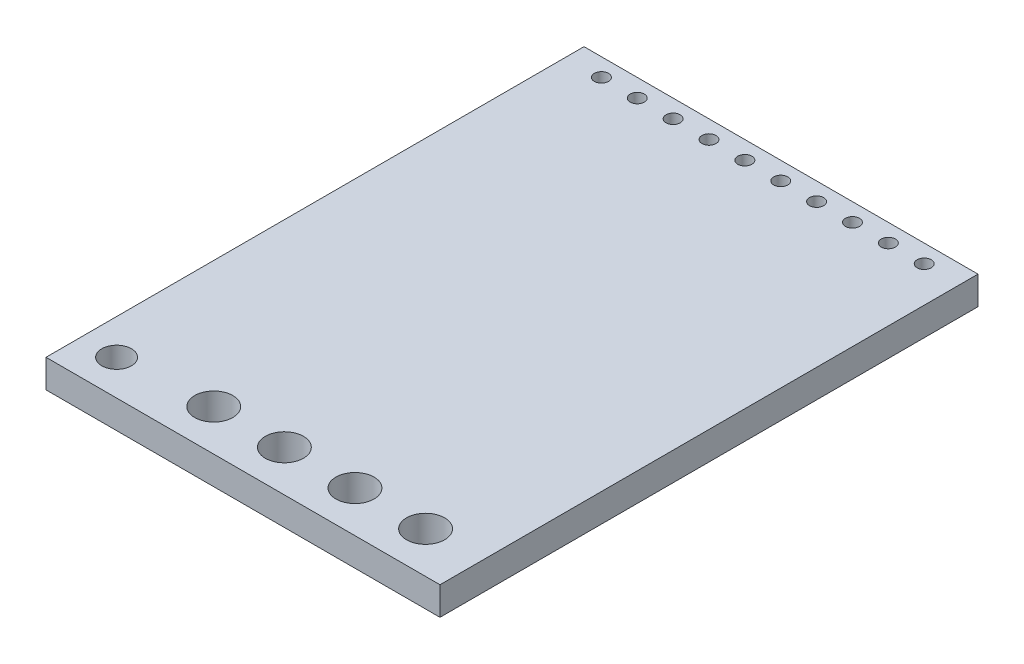
ISO-10303-21;
HEADER;
FILE_DESCRIPTION(('STEP AP214'),'2;1');
FILE_NAME('part.step','',(''),(''),'','','');
FILE_SCHEMA(('AUTOMOTIVE_DESIGN { 1 0 10303 214 1 1 1 1 }'));
ENDSEC;
DATA;
#1=APPLICATION_CONTEXT('core data for automotive mechanical design processes');
#2=APPLICATION_PROTOCOL_DEFINITION('international standard','automotive_design',2000,#1);
#3=PRODUCT_CONTEXT('',#1,'mechanical');
#4=PRODUCT('Part','Part','',(#3));
#5=PRODUCT_RELATED_PRODUCT_CATEGORY('part','',(#4));
#6=PRODUCT_DEFINITION_FORMATION('','',#4);
#7=PRODUCT_DEFINITION_CONTEXT('part definition',#1,'design');
#8=PRODUCT_DEFINITION('design','',#6,#7);
#9=PRODUCT_DEFINITION_SHAPE('','',#8);
#10=(LENGTH_UNIT() NAMED_UNIT(*) SI_UNIT(.MILLI.,.METRE.));
#11=(NAMED_UNIT(*) PLANE_ANGLE_UNIT() SI_UNIT($,.RADIAN.));
#12=(NAMED_UNIT(*) SI_UNIT($,.STERADIAN.) SOLID_ANGLE_UNIT());
#13=UNCERTAINTY_MEASURE_WITH_UNIT(LENGTH_MEASURE(1.E-05),#10,'distance_accuracy_value','');
#14=(GEOMETRIC_REPRESENTATION_CONTEXT(3) GLOBAL_UNCERTAINTY_ASSIGNED_CONTEXT((#13)) GLOBAL_UNIT_ASSIGNED_CONTEXT((#10,
#11,#12)) REPRESENTATION_CONTEXT('',''));
#15=CARTESIAN_POINT('',(0.,0.,0.));
#16=DIRECTION('',(0.,0.,1.));
#17=DIRECTION('',(1.,0.,0.));
#18=AXIS2_PLACEMENT_3D('',#15,#16,#17);
#19=CARTESIAN_POINT('',(0.,2.,0.));
#20=DIRECTION('',(0.,-1.,0.));
#21=DIRECTION('',(0.,0.,-1.));
#22=AXIS2_PLACEMENT_3D('',#19,#20,#21);
#23=PLANE('',#22);
#24=DIRECTION('',(0.,0.,-1.));
#25=VECTOR('',#24,1.);
#26=CARTESIAN_POINT('',(13.95,2.,19.05));
#27=LINE('',#26,#25);
#28=CARTESIAN_POINT('',(13.95,2.,19.05));
#29=VERTEX_POINT('',#28);
#30=CARTESIAN_POINT('',(13.9499999999998,2.,-19.0500000000001));
#31=VERTEX_POINT('',#30);
#32=EDGE_CURVE('E91',#29,#31,#27,.T.);
#33=ORIENTED_EDGE('',*,*,#32,.T.);
#34=DIRECTION('',(-1.,0.,0.));
#35=VECTOR('',#34,1.);
#36=CARTESIAN_POINT('',(-13.9500000000002,2.,-19.0499999999999));
#37=LINE('',#36,#35);
#38=CARTESIAN_POINT('',(-13.9500000000002,2.,-19.0499999999999));
#39=VERTEX_POINT('',#38);
#40=EDGE_CURVE('E86',#31,#39,#37,.T.);
#41=ORIENTED_EDGE('',*,*,#40,.T.);
#42=DIRECTION('',(0.,0.,1.));
#43=VECTOR('',#42,1.);
#44=CARTESIAN_POINT('',(-13.95,2.,19.0500000000001));
#45=LINE('',#44,#43);
#46=CARTESIAN_POINT('',(-13.95,2.,19.0500000000001));
#47=VERTEX_POINT('',#46);
#48=EDGE_CURVE('E89',#39,#47,#45,.T.);
#49=ORIENTED_EDGE('',*,*,#48,.T.);
#50=DIRECTION('',(1.,0.,0.));
#51=VECTOR('',#50,1.);
#52=CARTESIAN_POINT('',(-13.95,2.,19.0500000000001));
#53=LINE('',#52,#51);
#54=EDGE_CURVE('E56',#47,#29,#53,.T.);
#55=ORIENTED_EDGE('',*,*,#54,.T.);
#56=EDGE_LOOP('',(#33,#41,#49,#55));
#57=FACE_BOUND('',#56,.T.);
#58=CARTESIAN_POINT('',(-11.45,2.,16.55));
#59=DIRECTION('',(0.,1.,0.));
#60=DIRECTION('',(0.,0.,1.));
#61=AXIS2_PLACEMENT_3D('',#58,#59,#60);
#62=CIRCLE('',#61,1.05);
#63=CARTESIAN_POINT('',(-11.45,2.,17.6));
#64=VERTEX_POINT('',#63);
#65=EDGE_CURVE('E118',#64,#64,#62,.T.);
#66=ORIENTED_EDGE('',*,*,#65,.F.);
#67=EDGE_LOOP('',(#66));
#68=FACE_BOUND('',#67,.T.);
#69=CARTESIAN_POINT('',(11.4099999999998,2.,-17.7800000000001));
#70=DIRECTION('',(0.,1.,0.));
#71=DIRECTION('',(0.,0.,1.));
#72=AXIS2_PLACEMENT_3D('',#69,#70,#71);
#73=CIRCLE('',#72,0.500000000000179);
#74=CARTESIAN_POINT('',(11.4099999999998,2.,-17.2799999999999));
#75=VERTEX_POINT('',#74);
#76=EDGE_CURVE('E128',#75,#75,#73,.T.);
#77=ORIENTED_EDGE('',*,*,#76,.F.);
#78=EDGE_LOOP('',(#77));
#79=FACE_BOUND('',#78,.T.);
#80=CARTESIAN_POINT('',(10.01,2.,16.1300000000001));
#81=DIRECTION('',(0.,1.,0.));
#82=DIRECTION('',(0.,0.,1.));
#83=AXIS2_PLACEMENT_3D('',#80,#81,#82);
#84=CIRCLE('',#83,1.35000000000013);
#85=CARTESIAN_POINT('',(10.01,2.,17.4800000000002));
#86=VERTEX_POINT('',#85);
#87=EDGE_CURVE('E447',#86,#86,#84,.T.);
#88=ORIENTED_EDGE('',*,*,#87,.F.);
#89=EDGE_LOOP('',(#88));
#90=FACE_BOUND('',#89,.T.);
#91=CARTESIAN_POINT('',(8.86999999999953,2.,-17.78));
#92=DIRECTION('',(0.,1.,0.));
#93=DIRECTION('',(0.,0.,1.));
#94=AXIS2_PLACEMENT_3D('',#91,#92,#93);
#95=CIRCLE('',#94,0.500000000000438);
#96=CARTESIAN_POINT('',(8.86999999999953,2.,-17.2799999999996));
#97=VERTEX_POINT('',#96);
#98=EDGE_CURVE('E440',#97,#97,#95,.T.);
#99=ORIENTED_EDGE('',*,*,#98,.F.);
#100=EDGE_LOOP('',(#99));
#101=FACE_BOUND('',#100,.T.);
#102=CARTESIAN_POINT('',(6.32999999999953,2.,-17.78));
#103=DIRECTION('',(0.,1.,0.));
#104=DIRECTION('',(0.,0.,1.));
#105=AXIS2_PLACEMENT_3D('',#102,#103,#104);
#106=CIRCLE('',#105,0.500000000000438);
#107=CARTESIAN_POINT('',(6.32999999999953,2.,-17.2799999999996));
#108=VERTEX_POINT('',#107);
#109=EDGE_CURVE('E431',#108,#108,#106,.T.);
#110=ORIENTED_EDGE('',*,*,#109,.F.);
#111=EDGE_LOOP('',(#110));
#112=FACE_BOUND('',#111,.T.);
#113=CARTESIAN_POINT('',(3.78999999999953,2.,-17.78));
#114=DIRECTION('',(0.,1.,0.));
#115=DIRECTION('',(0.,0.,1.));
#116=AXIS2_PLACEMENT_3D('',#113,#114,#115);
#117=CIRCLE('',#116,0.500000000000438);
#118=CARTESIAN_POINT('',(3.78999999999953,2.,-17.2799999999996));
#119=VERTEX_POINT('',#118);
#120=EDGE_CURVE('E423',#119,#119,#117,.T.);
#121=ORIENTED_EDGE('',*,*,#120,.F.);
#122=EDGE_LOOP('',(#121));
#123=FACE_BOUND('',#122,.T.);
#124=CARTESIAN_POINT('',(1.24999999999953,2.,-17.78));
#125=DIRECTION('',(0.,1.,0.));
#126=DIRECTION('',(0.,0.,1.));
#127=AXIS2_PLACEMENT_3D('',#124,#125,#126);
#128=CIRCLE('',#127,0.500000000000438);
#129=CARTESIAN_POINT('',(1.24999999999953,2.,-17.2799999999995));
#130=VERTEX_POINT('',#129);
#131=EDGE_CURVE('E416',#130,#130,#128,.T.);
#132=ORIENTED_EDGE('',*,*,#131,.F.);
#133=EDGE_LOOP('',(#132));
#134=FACE_BOUND('',#133,.T.);
#135=CARTESIAN_POINT('',(-1.29000000000047,2.,-17.78));
#136=DIRECTION('',(0.,1.,0.));
#137=DIRECTION('',(0.,0.,1.));
#138=AXIS2_PLACEMENT_3D('',#135,#136,#137);
#139=CIRCLE('',#138,0.500000000000438);
#140=CARTESIAN_POINT('',(-1.29000000000047,2.,-17.2799999999995));
#141=VERTEX_POINT('',#140);
#142=EDGE_CURVE('E405',#141,#141,#139,.T.);
#143=ORIENTED_EDGE('',*,*,#142,.F.);
#144=EDGE_LOOP('',(#143));
#145=FACE_BOUND('',#144,.T.);
#146=CARTESIAN_POINT('',(-3.83000000000047,2.,-17.7799999999999));
#147=DIRECTION('',(0.,1.,0.));
#148=DIRECTION('',(0.,0.,1.));
#149=AXIS2_PLACEMENT_3D('',#146,#147,#148);
#150=CIRCLE('',#149,0.500000000000438);
#151=CARTESIAN_POINT('',(-3.83000000000047,2.,-17.2799999999995));
#152=VERTEX_POINT('',#151);
#153=EDGE_CURVE('E397',#152,#152,#150,.T.);
#154=ORIENTED_EDGE('',*,*,#153,.F.);
#155=EDGE_LOOP('',(#154));
#156=FACE_BOUND('',#155,.T.);
#157=CARTESIAN_POINT('',(-6.37000000000047,2.,-17.7799999999999));
#158=DIRECTION('',(0.,1.,0.));
#159=DIRECTION('',(0.,0.,1.));
#160=AXIS2_PLACEMENT_3D('',#157,#158,#159);
#161=CIRCLE('',#160,0.500000000000438);
#162=CARTESIAN_POINT('',(-6.37000000000047,2.,-17.2799999999995));
#163=VERTEX_POINT('',#162);
#164=EDGE_CURVE('E390',#163,#163,#161,.T.);
#165=ORIENTED_EDGE('',*,*,#164,.F.);
#166=EDGE_LOOP('',(#165));
#167=FACE_BOUND('',#166,.T.);
#168=CARTESIAN_POINT('',(-8.91000000000047,2.,-17.7799999999999));
#169=DIRECTION('',(0.,1.,0.));
#170=DIRECTION('',(0.,0.,1.));
#171=AXIS2_PLACEMENT_3D('',#168,#169,#170);
#172=CIRCLE('',#171,0.500000000000438);
#173=CARTESIAN_POINT('',(-8.91000000000047,2.,-17.2799999999995));
#174=VERTEX_POINT('',#173);
#175=EDGE_CURVE('E379',#174,#174,#172,.T.);
#176=ORIENTED_EDGE('',*,*,#175,.F.);
#177=EDGE_LOOP('',(#176));
#178=FACE_BOUND('',#177,.T.);
#179=CARTESIAN_POINT('',(-11.4500000000002,2.,-17.7800000000001));
#180=DIRECTION('',(0.,1.,0.));
#181=DIRECTION('',(0.,0.,1.));
#182=AXIS2_PLACEMENT_3D('',#179,#180,#181);
#183=CIRCLE('',#182,0.500000000000145);
#184=CARTESIAN_POINT('',(-11.4500000000002,2.,-17.2799999999999));
#185=VERTEX_POINT('',#184);
#186=EDGE_CURVE('E371',#185,#185,#183,.T.);
#187=ORIENTED_EDGE('',*,*,#186,.F.);
#188=EDGE_LOOP('',(#187));
#189=FACE_BOUND('',#188,.T.);
#190=CARTESIAN_POINT('',(5.0099999999999,2.,16.1300000000001));
#191=DIRECTION('',(0.,1.,0.));
#192=DIRECTION('',(0.,0.,1.));
#193=AXIS2_PLACEMENT_3D('',#190,#191,#192);
#194=CIRCLE('',#193,1.35);
#195=CARTESIAN_POINT('',(5.0099999999999,2.,17.4800000000001));
#196=VERTEX_POINT('',#195);
#197=EDGE_CURVE('E364',#196,#196,#194,.T.);
#198=ORIENTED_EDGE('',*,*,#197,.F.);
#199=EDGE_LOOP('',(#198));
#200=FACE_BOUND('',#199,.T.);
#201=CARTESIAN_POINT('',(0.00999999999939764,2.,16.1300000000002));
#202=DIRECTION('',(0.,1.,0.));
#203=DIRECTION('',(0.,0.,1.));
#204=AXIS2_PLACEMENT_3D('',#201,#202,#203);
#205=CIRCLE('',#204,1.35);
#206=CARTESIAN_POINT('',(0.00999999999939764,2.,17.4800000000002));
#207=VERTEX_POINT('',#206);
#208=EDGE_CURVE('E353',#207,#207,#205,.T.);
#209=ORIENTED_EDGE('',*,*,#208,.F.);
#210=EDGE_LOOP('',(#209));
#211=FACE_BOUND('',#210,.T.);
#212=CARTESIAN_POINT('',(-4.99000000000072,2.,16.1300000000002));
#213=DIRECTION('',(0.,1.,0.));
#214=DIRECTION('',(0.,0.,1.));
#215=AXIS2_PLACEMENT_3D('',#212,#213,#214);
#216=CIRCLE('',#215,1.35);
#217=CARTESIAN_POINT('',(-4.99000000000072,2.,17.4800000000002));
#218=VERTEX_POINT('',#217);
#219=EDGE_CURVE('E343',#218,#218,#216,.T.);
#220=ORIENTED_EDGE('',*,*,#219,.F.);
#221=EDGE_LOOP('',(#220));
#222=FACE_BOUND('',#221,.T.);
#223=ADVANCED_FACE('F39',(#57,#68,#79,#90,#101,#112,#123,#134,#145,#156,#167,#178,#189,#200,
#211,#222),#23,.F.);
#224=CARTESIAN_POINT('',(0.,0.,0.));
#225=DIRECTION('',(0.,-1.,0.));
#226=DIRECTION('',(0.,0.,-1.));
#227=AXIS2_PLACEMENT_3D('',#224,#225,#226);
#228=PLANE('',#227);
#229=CARTESIAN_POINT('',(0.00999999999939764,0.,16.1300000000002));
#230=DIRECTION('',(0.,1.,0.));
#231=DIRECTION('',(0.,0.,1.));
#232=AXIS2_PLACEMENT_3D('',#229,#230,#231);
#233=CIRCLE('',#232,1.35);
#234=CARTESIAN_POINT('',(0.00999999999939764,0.,17.4800000000002));
#235=VERTEX_POINT('',#234);
#236=EDGE_CURVE('E350',#235,#235,#233,.T.);
#237=ORIENTED_EDGE('',*,*,#236,.T.);
#238=EDGE_LOOP('',(#237));
#239=FACE_BOUND('',#238,.T.);
#240=CARTESIAN_POINT('',(-11.4500000000002,0.,-17.7800000000001));
#241=DIRECTION('',(0.,1.,0.));
#242=DIRECTION('',(0.,0.,1.));
#243=AXIS2_PLACEMENT_3D('',#240,#241,#242);
#244=CIRCLE('',#243,0.500000000000145);
#245=CARTESIAN_POINT('',(-11.4500000000002,0.,-17.2799999999999));
#246=VERTEX_POINT('',#245);
#247=EDGE_CURVE('E369',#246,#246,#244,.T.);
#248=ORIENTED_EDGE('',*,*,#247,.T.);
#249=EDGE_LOOP('',(#248));
#250=FACE_BOUND('',#249,.T.);
#251=CARTESIAN_POINT('',(-6.37000000000047,0.,-17.7799999999999));
#252=DIRECTION('',(0.,1.,0.));
#253=DIRECTION('',(0.,0.,1.));
#254=AXIS2_PLACEMENT_3D('',#251,#252,#253);
#255=CIRCLE('',#254,0.500000000000438);
#256=CARTESIAN_POINT('',(-6.37000000000047,0.,-17.2799999999995));
#257=VERTEX_POINT('',#256);
#258=EDGE_CURVE('E384',#257,#257,#255,.T.);
#259=ORIENTED_EDGE('',*,*,#258,.T.);
#260=EDGE_LOOP('',(#259));
#261=FACE_BOUND('',#260,.T.);
#262=CARTESIAN_POINT('',(-1.29000000000047,0.,-17.78));
#263=DIRECTION('',(0.,1.,0.));
#264=DIRECTION('',(0.,0.,1.));
#265=AXIS2_PLACEMENT_3D('',#262,#263,#264);
#266=CIRCLE('',#265,0.500000000000438);
#267=CARTESIAN_POINT('',(-1.29000000000047,0.,-17.2799999999995));
#268=VERTEX_POINT('',#267);
#269=EDGE_CURVE('E402',#268,#268,#266,.T.);
#270=ORIENTED_EDGE('',*,*,#269,.T.);
#271=EDGE_LOOP('',(#270));
#272=FACE_BOUND('',#271,.T.);
#273=CARTESIAN_POINT('',(3.78999999999953,0.,-17.78));
#274=DIRECTION('',(0.,1.,0.));
#275=DIRECTION('',(0.,0.,1.));
#276=AXIS2_PLACEMENT_3D('',#273,#274,#275);
#277=CIRCLE('',#276,0.500000000000438);
#278=CARTESIAN_POINT('',(3.78999999999953,0.,-17.2799999999996));
#279=VERTEX_POINT('',#278);
#280=EDGE_CURVE('E421',#279,#279,#277,.T.);
#281=ORIENTED_EDGE('',*,*,#280,.T.);
#282=EDGE_LOOP('',(#281));
#283=FACE_BOUND('',#282,.T.);
#284=CARTESIAN_POINT('',(8.86999999999953,0.,-17.78));
#285=DIRECTION('',(0.,1.,0.));
#286=DIRECTION('',(0.,0.,1.));
#287=AXIS2_PLACEMENT_3D('',#284,#285,#286);
#288=CIRCLE('',#287,0.500000000000438);
#289=CARTESIAN_POINT('',(8.86999999999953,0.,-17.2799999999996));
#290=VERTEX_POINT('',#289);
#291=EDGE_CURVE('E436',#290,#290,#288,.T.);
#292=ORIENTED_EDGE('',*,*,#291,.T.);
#293=EDGE_LOOP('',(#292));
#294=FACE_BOUND('',#293,.T.);
#295=CARTESIAN_POINT('',(11.4099999999998,0.,-17.7800000000001));
#296=DIRECTION('',(0.,1.,0.));
#297=DIRECTION('',(0.,0.,1.));
#298=AXIS2_PLACEMENT_3D('',#295,#296,#297);
#299=CIRCLE('',#298,0.500000000000179);
#300=CARTESIAN_POINT('',(11.4099999999998,0.,-17.2799999999999));
#301=VERTEX_POINT('',#300);
#302=EDGE_CURVE('E126',#301,#301,#299,.T.);
#303=ORIENTED_EDGE('',*,*,#302,.T.);
#304=EDGE_LOOP('',(#303));
#305=FACE_BOUND('',#304,.T.);
#306=DIRECTION('',(0.,0.,-1.));
#307=VECTOR('',#306,1.);
#308=CARTESIAN_POINT('',(13.95,0.,19.05));
#309=LINE('',#308,#307);
#310=CARTESIAN_POINT('',(13.95,0.,19.05));
#311=VERTEX_POINT('',#310);
#312=CARTESIAN_POINT('',(13.9499999999998,0.,-19.0500000000001));
#313=VERTEX_POINT('',#312);
#314=EDGE_CURVE('E124',#311,#313,#309,.T.);
#315=ORIENTED_EDGE('',*,*,#314,.F.);
#316=DIRECTION('',(1.,0.,0.));
#317=VECTOR('',#316,1.);
#318=CARTESIAN_POINT('',(-13.95,0.,19.0500000000001));
#319=LINE('',#318,#317);
#320=CARTESIAN_POINT('',(-13.95,0.,19.0500000000001));
#321=VERTEX_POINT('',#320);
#322=EDGE_CURVE('E79',#321,#311,#319,.T.);
#323=ORIENTED_EDGE('',*,*,#322,.F.);
#324=DIRECTION('',(0.,0.,1.));
#325=VECTOR('',#324,1.);
#326=CARTESIAN_POINT('',(-13.95,0.,19.0500000000001));
#327=LINE('',#326,#325);
#328=CARTESIAN_POINT('',(-13.9500000000002,0.,-19.0499999999999));
#329=VERTEX_POINT('',#328);
#330=EDGE_CURVE('E73',#329,#321,#327,.T.);
#331=ORIENTED_EDGE('',*,*,#330,.F.);
#332=DIRECTION('',(-1.,0.,0.));
#333=VECTOR('',#332,1.);
#334=CARTESIAN_POINT('',(-13.9500000000002,0.,-19.0499999999999));
#335=LINE('',#334,#333);
#336=EDGE_CURVE('E96',#313,#329,#335,.T.);
#337=ORIENTED_EDGE('',*,*,#336,.F.);
#338=EDGE_LOOP('',(#315,#323,#331,#337));
#339=FACE_BOUND('',#338,.T.);
#340=CARTESIAN_POINT('',(-11.45,0.,16.55));
#341=DIRECTION('',(0.,1.,0.));
#342=DIRECTION('',(0.,0.,1.));
#343=AXIS2_PLACEMENT_3D('',#340,#341,#342);
#344=CIRCLE('',#343,1.05);
#345=CARTESIAN_POINT('',(-11.45,0.,17.6));
#346=VERTEX_POINT('',#345);
#347=EDGE_CURVE('E125',#346,#346,#344,.T.);
#348=ORIENTED_EDGE('',*,*,#347,.T.);
#349=EDGE_LOOP('',(#348));
#350=FACE_BOUND('',#349,.T.);
#351=CARTESIAN_POINT('',(10.01,0.,16.1300000000001));
#352=DIRECTION('',(0.,1.,0.));
#353=DIRECTION('',(0.,0.,1.));
#354=AXIS2_PLACEMENT_3D('',#351,#352,#353);
#355=CIRCLE('',#354,1.35000000000013);
#356=CARTESIAN_POINT('',(10.01,0.,17.4800000000002));
#357=VERTEX_POINT('',#356);
#358=EDGE_CURVE('E445',#357,#357,#355,.T.);
#359=ORIENTED_EDGE('',*,*,#358,.T.);
#360=EDGE_LOOP('',(#359));
#361=FACE_BOUND('',#360,.T.);
#362=CARTESIAN_POINT('',(6.32999999999953,0.,-17.78));
#363=DIRECTION('',(0.,1.,0.));
#364=DIRECTION('',(0.,0.,1.));
#365=AXIS2_PLACEMENT_3D('',#362,#363,#364);
#366=CIRCLE('',#365,0.500000000000438);
#367=CARTESIAN_POINT('',(6.32999999999953,0.,-17.2799999999996));
#368=VERTEX_POINT('',#367);
#369=EDGE_CURVE('E428',#368,#368,#366,.T.);
#370=ORIENTED_EDGE('',*,*,#369,.T.);
#371=EDGE_LOOP('',(#370));
#372=FACE_BOUND('',#371,.T.);
#373=CARTESIAN_POINT('',(1.24999999999953,0.,-17.78));
#374=DIRECTION('',(0.,1.,0.));
#375=DIRECTION('',(0.,0.,1.));
#376=AXIS2_PLACEMENT_3D('',#373,#374,#375);
#377=CIRCLE('',#376,0.500000000000438);
#378=CARTESIAN_POINT('',(1.24999999999953,0.,-17.2799999999995));
#379=VERTEX_POINT('',#378);
#380=EDGE_CURVE('E410',#379,#379,#377,.T.);
#381=ORIENTED_EDGE('',*,*,#380,.T.);
#382=EDGE_LOOP('',(#381));
#383=FACE_BOUND('',#382,.T.);
#384=CARTESIAN_POINT('',(-3.83000000000047,0.,-17.7799999999999));
#385=DIRECTION('',(0.,1.,0.));
#386=DIRECTION('',(0.,0.,1.));
#387=AXIS2_PLACEMENT_3D('',#384,#385,#386);
#388=CIRCLE('',#387,0.500000000000438);
#389=CARTESIAN_POINT('',(-3.83000000000047,0.,-17.2799999999995));
#390=VERTEX_POINT('',#389);
#391=EDGE_CURVE('E395',#390,#390,#388,.T.);
#392=ORIENTED_EDGE('',*,*,#391,.T.);
#393=EDGE_LOOP('',(#392));
#394=FACE_BOUND('',#393,.T.);
#395=CARTESIAN_POINT('',(-8.91000000000047,0.,-17.7799999999999));
#396=DIRECTION('',(0.,1.,0.));
#397=DIRECTION('',(0.,0.,1.));
#398=AXIS2_PLACEMENT_3D('',#395,#396,#397);
#399=CIRCLE('',#398,0.500000000000438);
#400=CARTESIAN_POINT('',(-8.91000000000047,0.,-17.2799999999995));
#401=VERTEX_POINT('',#400);
#402=EDGE_CURVE('E376',#401,#401,#399,.T.);
#403=ORIENTED_EDGE('',*,*,#402,.T.);
#404=EDGE_LOOP('',(#403));
#405=FACE_BOUND('',#404,.T.);
#406=CARTESIAN_POINT('',(5.0099999999999,0.,16.1300000000001));
#407=DIRECTION('',(0.,1.,0.));
#408=DIRECTION('',(0.,0.,1.));
#409=AXIS2_PLACEMENT_3D('',#406,#407,#408);
#410=CIRCLE('',#409,1.35);
#411=CARTESIAN_POINT('',(5.0099999999999,0.,17.4800000000001));
#412=VERTEX_POINT('',#411);
#413=EDGE_CURVE('E358',#412,#412,#410,.T.);
#414=ORIENTED_EDGE('',*,*,#413,.T.);
#415=EDGE_LOOP('',(#414));
#416=FACE_BOUND('',#415,.T.);
#417=CARTESIAN_POINT('',(-4.99000000000072,0.,16.1300000000002));
#418=DIRECTION('',(0.,1.,0.));
#419=DIRECTION('',(0.,0.,1.));
#420=AXIS2_PLACEMENT_3D('',#417,#418,#419);
#421=CIRCLE('',#420,1.35);
#422=CARTESIAN_POINT('',(-4.99000000000072,0.,17.4800000000002));
#423=VERTEX_POINT('',#422);
#424=EDGE_CURVE('E346',#423,#423,#421,.T.);
#425=ORIENTED_EDGE('',*,*,#424,.T.);
#426=EDGE_LOOP('',(#425));
#427=FACE_BOUND('',#426,.T.);
#428=ADVANCED_FACE('F139',(#239,#250,#261,#272,#283,#294,#305,#339,#350,#361,#372,#383,#394,
#405,#416,#427),#228,.T.);
#429=CARTESIAN_POINT('',(13.95,2.,19.05));
#430=DIRECTION('',(-1.,0.,0.));
#431=DIRECTION('',(0.,0.,1.));
#432=AXIS2_PLACEMENT_3D('',#429,#430,#431);
#433=PLANE('',#432);
#434=ORIENTED_EDGE('',*,*,#314,.T.);
#435=DIRECTION('',(0.,-1.,0.));
#436=VECTOR('',#435,1.);
#437=CARTESIAN_POINT('',(13.9499999999998,2.,-19.0500000000001));
#438=LINE('',#437,#436);
#439=EDGE_CURVE('E12',#31,#313,#438,.T.);
#440=ORIENTED_EDGE('',*,*,#439,.F.);
#441=ORIENTED_EDGE('',*,*,#32,.F.);
#442=DIRECTION('',(0.,-1.,0.));
#443=VECTOR('',#442,1.);
#444=CARTESIAN_POINT('',(13.95,2.,19.05));
#445=LINE('',#444,#443);
#446=EDGE_CURVE('E102',#29,#311,#445,.T.);
#447=ORIENTED_EDGE('',*,*,#446,.T.);
#448=EDGE_LOOP('',(#434,#440,#441,#447));
#449=FACE_BOUND('',#448,.T.);
#450=ADVANCED_FACE('F41',(#449),#433,.F.);
#451=CARTESIAN_POINT('',(-13.9500000000002,2.,-19.0499999999999));
#452=DIRECTION('',(0.,0.,1.));
#453=DIRECTION('',(1.,0.,0.));
#454=AXIS2_PLACEMENT_3D('',#451,#452,#453);
#455=PLANE('',#454);
#456=ORIENTED_EDGE('',*,*,#336,.T.);
#457=DIRECTION('',(0.,-1.,0.));
#458=VECTOR('',#457,1.);
#459=CARTESIAN_POINT('',(-13.9500000000002,2.,-19.0499999999999));
#460=LINE('',#459,#458);
#461=EDGE_CURVE('E48',#39,#329,#460,.T.);
#462=ORIENTED_EDGE('',*,*,#461,.F.);
#463=ORIENTED_EDGE('',*,*,#40,.F.);
#464=ORIENTED_EDGE('',*,*,#439,.T.);
#465=EDGE_LOOP('',(#456,#462,#463,#464));
#466=FACE_BOUND('',#465,.T.);
#467=ADVANCED_FACE('F95',(#466),#455,.F.);
#468=CARTESIAN_POINT('',(-13.95,2.,19.0500000000001));
#469=DIRECTION('',(1.,0.,0.));
#470=DIRECTION('',(0.,0.,-1.));
#471=AXIS2_PLACEMENT_3D('',#468,#469,#470);
#472=PLANE('',#471);
#473=ORIENTED_EDGE('',*,*,#330,.T.);
#474=DIRECTION('',(0.,-1.,0.));
#475=VECTOR('',#474,1.);
#476=CARTESIAN_POINT('',(-13.95,2.,19.0500000000001));
#477=LINE('',#476,#475);
#478=EDGE_CURVE('E97',#47,#321,#477,.T.);
#479=ORIENTED_EDGE('',*,*,#478,.F.);
#480=ORIENTED_EDGE('',*,*,#48,.F.);
#481=ORIENTED_EDGE('',*,*,#461,.T.);
#482=EDGE_LOOP('',(#473,#479,#480,#481));
#483=FACE_BOUND('',#482,.T.);
#484=ADVANCED_FACE('F98',(#483),#472,.F.);
#485=CARTESIAN_POINT('',(-13.95,2.,19.0500000000001));
#486=DIRECTION('',(0.,0.,-1.));
#487=DIRECTION('',(-1.,0.,0.));
#488=AXIS2_PLACEMENT_3D('',#485,#486,#487);
#489=PLANE('',#488);
#490=ORIENTED_EDGE('',*,*,#322,.T.);
#491=ORIENTED_EDGE('',*,*,#446,.F.);
#492=ORIENTED_EDGE('',*,*,#54,.F.);
#493=ORIENTED_EDGE('',*,*,#478,.T.);
#494=EDGE_LOOP('',(#490,#491,#492,#493));
#495=FACE_BOUND('',#494,.T.);
#496=ADVANCED_FACE('F136',(#495),#489,.F.);
#497=CARTESIAN_POINT('',(-11.45,2.,16.55));
#498=DIRECTION('',(0.,-1.,0.));
#499=DIRECTION('',(0.,0.,-1.));
#500=AXIS2_PLACEMENT_3D('',#497,#498,#499);
#501=CYLINDRICAL_SURFACE('',#500,1.05);
#502=ORIENTED_EDGE('',*,*,#65,.T.);
#503=EDGE_LOOP('',(#502));
#504=FACE_BOUND('',#503,.T.);
#505=ORIENTED_EDGE('',*,*,#347,.F.);
#506=EDGE_LOOP('',(#505));
#507=FACE_BOUND('',#506,.T.);
#508=ADVANCED_FACE('F155',(#504,#507),#501,.F.);
#509=CARTESIAN_POINT('',(11.4099999999998,2.,-17.7800000000001));
#510=DIRECTION('',(0.,-1.,0.));
#511=DIRECTION('',(0.,0.,-1.));
#512=AXIS2_PLACEMENT_3D('',#509,#510,#511);
#513=CYLINDRICAL_SURFACE('',#512,0.500000000000179);
#514=ORIENTED_EDGE('',*,*,#76,.T.);
#515=EDGE_LOOP('',(#514));
#516=FACE_BOUND('',#515,.T.);
#517=ORIENTED_EDGE('',*,*,#302,.F.);
#518=EDGE_LOOP('',(#517));
#519=FACE_BOUND('',#518,.T.);
#520=ADVANCED_FACE('F175',(#516,#519),#513,.F.);
#521=CARTESIAN_POINT('',(10.01,2.,16.1300000000001));
#522=DIRECTION('',(0.,-1.,0.));
#523=DIRECTION('',(0.,0.,-1.));
#524=AXIS2_PLACEMENT_3D('',#521,#522,#523);
#525=CYLINDRICAL_SURFACE('',#524,1.35000000000013);
#526=ORIENTED_EDGE('',*,*,#87,.T.);
#527=EDGE_LOOP('',(#526));
#528=FACE_BOUND('',#527,.T.);
#529=ORIENTED_EDGE('',*,*,#358,.F.);
#530=EDGE_LOOP('',(#529));
#531=FACE_BOUND('',#530,.T.);
#532=ADVANCED_FACE('F182',(#528,#531),#525,.F.);
#533=CARTESIAN_POINT('',(8.86999999999953,2.,-17.78));
#534=DIRECTION('',(0.,-1.,0.));
#535=DIRECTION('',(0.,0.,-1.));
#536=AXIS2_PLACEMENT_3D('',#533,#534,#535);
#537=CYLINDRICAL_SURFACE('',#536,0.500000000000438);
#538=ORIENTED_EDGE('',*,*,#98,.T.);
#539=EDGE_LOOP('',(#538));
#540=FACE_BOUND('',#539,.T.);
#541=ORIENTED_EDGE('',*,*,#291,.F.);
#542=EDGE_LOOP('',(#541));
#543=FACE_BOUND('',#542,.T.);
#544=ADVANCED_FACE('F189',(#540,#543),#537,.F.);
#545=CARTESIAN_POINT('',(6.32999999999953,2.,-17.78));
#546=DIRECTION('',(0.,-1.,0.));
#547=DIRECTION('',(0.,0.,-1.));
#548=AXIS2_PLACEMENT_3D('',#545,#546,#547);
#549=CYLINDRICAL_SURFACE('',#548,0.500000000000438);
#550=ORIENTED_EDGE('',*,*,#109,.T.);
#551=EDGE_LOOP('',(#550));
#552=FACE_BOUND('',#551,.T.);
#553=ORIENTED_EDGE('',*,*,#369,.F.);
#554=EDGE_LOOP('',(#553));
#555=FACE_BOUND('',#554,.T.);
#556=ADVANCED_FACE('F197',(#552,#555),#549,.F.);
#557=CARTESIAN_POINT('',(3.78999999999953,2.,-17.78));
#558=DIRECTION('',(0.,-1.,0.));
#559=DIRECTION('',(0.,0.,-1.));
#560=AXIS2_PLACEMENT_3D('',#557,#558,#559);
#561=CYLINDRICAL_SURFACE('',#560,0.500000000000438);
#562=ORIENTED_EDGE('',*,*,#120,.T.);
#563=EDGE_LOOP('',(#562));
#564=FACE_BOUND('',#563,.T.);
#565=ORIENTED_EDGE('',*,*,#280,.F.);
#566=EDGE_LOOP('',(#565));
#567=FACE_BOUND('',#566,.T.);
#568=ADVANCED_FACE('F205',(#564,#567),#561,.F.);
#569=CARTESIAN_POINT('',(1.24999999999953,2.,-17.78));
#570=DIRECTION('',(0.,-1.,0.));
#571=DIRECTION('',(0.,0.,-1.));
#572=AXIS2_PLACEMENT_3D('',#569,#570,#571);
#573=CYLINDRICAL_SURFACE('',#572,0.500000000000438);
#574=ORIENTED_EDGE('',*,*,#131,.T.);
#575=EDGE_LOOP('',(#574));
#576=FACE_BOUND('',#575,.T.);
#577=ORIENTED_EDGE('',*,*,#380,.F.);
#578=EDGE_LOOP('',(#577));
#579=FACE_BOUND('',#578,.T.);
#580=ADVANCED_FACE('F213',(#576,#579),#573,.F.);
#581=CARTESIAN_POINT('',(-1.29000000000047,2.,-17.78));
#582=DIRECTION('',(0.,-1.,0.));
#583=DIRECTION('',(0.,0.,-1.));
#584=AXIS2_PLACEMENT_3D('',#581,#582,#583);
#585=CYLINDRICAL_SURFACE('',#584,0.500000000000438);
#586=ORIENTED_EDGE('',*,*,#142,.T.);
#587=EDGE_LOOP('',(#586));
#588=FACE_BOUND('',#587,.T.);
#589=ORIENTED_EDGE('',*,*,#269,.F.);
#590=EDGE_LOOP('',(#589));
#591=FACE_BOUND('',#590,.T.);
#592=ADVANCED_FACE('F221',(#588,#591),#585,.F.);
#593=CARTESIAN_POINT('',(-3.83000000000047,2.,-17.7799999999999));
#594=DIRECTION('',(0.,-1.,0.));
#595=DIRECTION('',(0.,0.,-1.));
#596=AXIS2_PLACEMENT_3D('',#593,#594,#595);
#597=CYLINDRICAL_SURFACE('',#596,0.500000000000438);
#598=ORIENTED_EDGE('',*,*,#153,.T.);
#599=EDGE_LOOP('',(#598));
#600=FACE_BOUND('',#599,.T.);
#601=ORIENTED_EDGE('',*,*,#391,.F.);
#602=EDGE_LOOP('',(#601));
#603=FACE_BOUND('',#602,.T.);
#604=ADVANCED_FACE('F229',(#600,#603),#597,.F.);
#605=CARTESIAN_POINT('',(-6.37000000000047,2.,-17.7799999999999));
#606=DIRECTION('',(0.,-1.,0.));
#607=DIRECTION('',(0.,0.,-1.));
#608=AXIS2_PLACEMENT_3D('',#605,#606,#607);
#609=CYLINDRICAL_SURFACE('',#608,0.500000000000438);
#610=ORIENTED_EDGE('',*,*,#164,.T.);
#611=EDGE_LOOP('',(#610));
#612=FACE_BOUND('',#611,.T.);
#613=ORIENTED_EDGE('',*,*,#258,.F.);
#614=EDGE_LOOP('',(#613));
#615=FACE_BOUND('',#614,.T.);
#616=ADVANCED_FACE('F237',(#612,#615),#609,.F.);
#617=CARTESIAN_POINT('',(-8.91000000000047,2.,-17.7799999999999));
#618=DIRECTION('',(0.,-1.,0.));
#619=DIRECTION('',(0.,0.,-1.));
#620=AXIS2_PLACEMENT_3D('',#617,#618,#619);
#621=CYLINDRICAL_SURFACE('',#620,0.500000000000438);
#622=ORIENTED_EDGE('',*,*,#175,.T.);
#623=EDGE_LOOP('',(#622));
#624=FACE_BOUND('',#623,.T.);
#625=ORIENTED_EDGE('',*,*,#402,.F.);
#626=EDGE_LOOP('',(#625));
#627=FACE_BOUND('',#626,.T.);
#628=ADVANCED_FACE('F245',(#624,#627),#621,.F.);
#629=CARTESIAN_POINT('',(-11.4500000000002,2.,-17.7800000000001));
#630=DIRECTION('',(0.,-1.,0.));
#631=DIRECTION('',(0.,0.,-1.));
#632=AXIS2_PLACEMENT_3D('',#629,#630,#631);
#633=CYLINDRICAL_SURFACE('',#632,0.500000000000145);
#634=ORIENTED_EDGE('',*,*,#186,.T.);
#635=EDGE_LOOP('',(#634));
#636=FACE_BOUND('',#635,.T.);
#637=ORIENTED_EDGE('',*,*,#247,.F.);
#638=EDGE_LOOP('',(#637));
#639=FACE_BOUND('',#638,.T.);
#640=ADVANCED_FACE('F253',(#636,#639),#633,.F.);
#641=CARTESIAN_POINT('',(5.0099999999999,2.,16.1300000000001));
#642=DIRECTION('',(0.,-1.,0.));
#643=DIRECTION('',(0.,0.,-1.));
#644=AXIS2_PLACEMENT_3D('',#641,#642,#643);
#645=CYLINDRICAL_SURFACE('',#644,1.35);
#646=ORIENTED_EDGE('',*,*,#197,.T.);
#647=EDGE_LOOP('',(#646));
#648=FACE_BOUND('',#647,.T.);
#649=ORIENTED_EDGE('',*,*,#413,.F.);
#650=EDGE_LOOP('',(#649));
#651=FACE_BOUND('',#650,.T.);
#652=ADVANCED_FACE('F261',(#648,#651),#645,.F.);
#653=CARTESIAN_POINT('',(0.00999999999939764,2.,16.1300000000002));
#654=DIRECTION('',(0.,-1.,0.));
#655=DIRECTION('',(0.,0.,-1.));
#656=AXIS2_PLACEMENT_3D('',#653,#654,#655);
#657=CYLINDRICAL_SURFACE('',#656,1.35);
#658=ORIENTED_EDGE('',*,*,#208,.T.);
#659=EDGE_LOOP('',(#658));
#660=FACE_BOUND('',#659,.T.);
#661=ORIENTED_EDGE('',*,*,#236,.F.);
#662=EDGE_LOOP('',(#661));
#663=FACE_BOUND('',#662,.T.);
#664=ADVANCED_FACE('F269',(#660,#663),#657,.F.);
#665=CARTESIAN_POINT('',(-4.99000000000072,2.,16.1300000000002));
#666=DIRECTION('',(0.,-1.,0.));
#667=DIRECTION('',(0.,0.,-1.));
#668=AXIS2_PLACEMENT_3D('',#665,#666,#667);
#669=CYLINDRICAL_SURFACE('',#668,1.35);
#670=ORIENTED_EDGE('',*,*,#219,.T.);
#671=EDGE_LOOP('',(#670));
#672=FACE_BOUND('',#671,.T.);
#673=ORIENTED_EDGE('',*,*,#424,.F.);
#674=EDGE_LOOP('',(#673));
#675=FACE_BOUND('',#674,.T.);
#676=ADVANCED_FACE('F277',(#672,#675),#669,.F.);
#677=CLOSED_SHELL('',(#223,#428,#450,#467,#484,#496,#508,#520,#532,#544,#556,#568,#580,#592,
#604,#616,#628,#640,#652,#664,#676));
#678=MANIFOLD_SOLID_BREP('B2',#677);
#679=ADVANCED_BREP_SHAPE_REPRESENTATION('',(#18,#678),#14);
#680=SHAPE_DEFINITION_REPRESENTATION(#9,#679);
ENDSEC;
END-ISO-10303-21;
